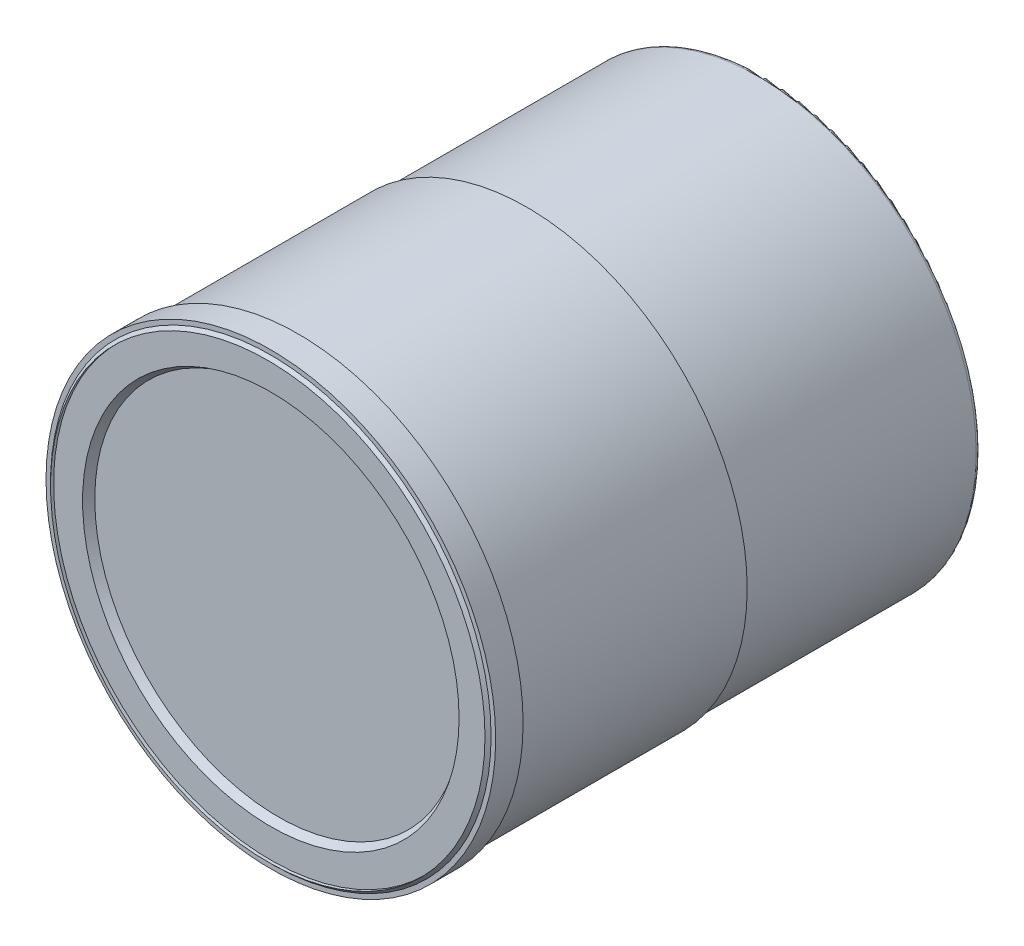
ISO-10303-21;
HEADER;
FILE_DESCRIPTION(('STEP AP214'),'2;1');
FILE_NAME('part.step','',(''),(''),'','','');
FILE_SCHEMA(('AUTOMOTIVE_DESIGN { 1 0 10303 214 1 1 1 1 }'));
ENDSEC;
DATA;
#1=APPLICATION_CONTEXT('core data for automotive mechanical design processes');
#2=APPLICATION_PROTOCOL_DEFINITION('international standard','automotive_design',2000,#1);
#3=PRODUCT_CONTEXT('',#1,'mechanical');
#4=PRODUCT('Part','Part','',(#3));
#5=PRODUCT_RELATED_PRODUCT_CATEGORY('part','',(#4));
#6=PRODUCT_DEFINITION_FORMATION('','',#4);
#7=PRODUCT_DEFINITION_CONTEXT('part definition',#1,'design');
#8=PRODUCT_DEFINITION('design','',#6,#7);
#9=PRODUCT_DEFINITION_SHAPE('','',#8);
#10=(LENGTH_UNIT() NAMED_UNIT(*) SI_UNIT(.MILLI.,.METRE.));
#11=(NAMED_UNIT(*) PLANE_ANGLE_UNIT() SI_UNIT($,.RADIAN.));
#12=(NAMED_UNIT(*) SI_UNIT($,.STERADIAN.) SOLID_ANGLE_UNIT());
#13=UNCERTAINTY_MEASURE_WITH_UNIT(LENGTH_MEASURE(1.E-05),#10,'distance_accuracy_value','');
#14=(GEOMETRIC_REPRESENTATION_CONTEXT(3) GLOBAL_UNCERTAINTY_ASSIGNED_CONTEXT((#13)) GLOBAL_UNIT_ASSIGNED_CONTEXT((#10,
#11,#12)) REPRESENTATION_CONTEXT('',''));
#15=CARTESIAN_POINT('',(0.,0.,0.));
#16=DIRECTION('',(0.,0.,1.));
#17=DIRECTION('',(1.,0.,0.));
#18=AXIS2_PLACEMENT_3D('',#15,#16,#17);
#19=CARTESIAN_POINT('',(0.,0.,160.1));
#20=DIRECTION('',(0.,0.,-1.));
#21=DIRECTION('',(-1.,0.,0.));
#22=AXIS2_PLACEMENT_3D('',#19,#20,#21);
#23=CYLINDRICAL_SURFACE('',#22,72.25);
#24=CARTESIAN_POINT('',(0.,0.,77.6));
#25=DIRECTION('',(0.,0.,1.));
#26=DIRECTION('',(1.,0.,0.));
#27=AXIS2_PLACEMENT_3D('',#24,#25,#26);
#28=CIRCLE('',#27,72.25);
#29=CARTESIAN_POINT('',(72.25,0.,77.6));
#30=VERTEX_POINT('',#29);
#31=EDGE_CURVE('E90',#30,#30,#28,.T.);
#32=ORIENTED_EDGE('',*,*,#31,.T.);
#33=EDGE_LOOP('',(#32));
#34=FACE_BOUND('',#33,.T.);
#35=CARTESIAN_POINT('',(0.,0.,152.600000014));
#36=DIRECTION('',(0.,0.,1.));
#37=DIRECTION('',(1.,0.,0.));
#38=AXIS2_PLACEMENT_3D('',#35,#36,#37);
#39=CIRCLE('',#38,72.25);
#40=CARTESIAN_POINT('',(72.25,0.,152.600000014));
#41=VERTEX_POINT('',#40);
#42=EDGE_CURVE('E63',#41,#41,#39,.T.);
#43=ORIENTED_EDGE('',*,*,#42,.F.);
#44=EDGE_LOOP('',(#43));
#45=FACE_BOUND('',#44,.T.);
#46=ADVANCED_FACE('F51',(#34,#45),#23,.T.);
#47=CARTESIAN_POINT('',(0.,0.,77.6));
#48=DIRECTION('',(0.,0.,-1.));
#49=DIRECTION('',(-1.,0.,0.));
#50=AXIS2_PLACEMENT_3D('',#47,#48,#49);
#51=CYLINDRICAL_SURFACE('',#50,71.25);
#52=CARTESIAN_POINT('',(0.,0.,1.5));
#53=DIRECTION('',(0.,0.,1.));
#54=DIRECTION('',(1.,0.,0.));
#55=AXIS2_PLACEMENT_3D('',#52,#53,#54);
#56=CIRCLE('',#55,71.25);
#57=CARTESIAN_POINT('',(71.25,0.,1.5));
#58=VERTEX_POINT('',#57);
#59=EDGE_CURVE('E84',#58,#58,#56,.T.);
#60=ORIENTED_EDGE('',*,*,#59,.T.);
#61=EDGE_LOOP('',(#60));
#62=FACE_BOUND('',#61,.T.);
#63=CARTESIAN_POINT('',(0.,0.,77.6));
#64=DIRECTION('',(0.,0.,1.));
#65=DIRECTION('',(1.,0.,0.));
#66=AXIS2_PLACEMENT_3D('',#63,#64,#65);
#67=CIRCLE('',#66,71.25);
#68=CARTESIAN_POINT('',(71.25,0.,77.6));
#69=VERTEX_POINT('',#68);
#70=EDGE_CURVE('E87',#69,#69,#67,.T.);
#71=ORIENTED_EDGE('',*,*,#70,.F.);
#72=EDGE_LOOP('',(#71));
#73=FACE_BOUND('',#72,.T.);
#74=ADVANCED_FACE('F120',(#62,#73),#51,.T.);
#75=CARTESIAN_POINT('',(0.,0.,0.));
#76=DIRECTION('',(0.,0.,1.));
#77=DIRECTION('',(1.,0.,0.));
#78=AXIS2_PLACEMENT_3D('',#75,#76,#77);
#79=PLANE('',#78);
#80=CARTESIAN_POINT('',(0.,0.,0.));
#81=DIRECTION('',(0.,0.,1.));
#82=DIRECTION('',(1.,0.,0.));
#83=AXIS2_PLACEMENT_3D('',#80,#81,#82);
#84=CIRCLE('',#83,69.75);
#85=CARTESIAN_POINT('',(69.75,0.,0.));
#86=VERTEX_POINT('',#85);
#87=EDGE_CURVE('E78',#86,#86,#84,.F.);
#88=ORIENTED_EDGE('',*,*,#87,.T.);
#89=EDGE_LOOP('',(#88));
#90=FACE_BOUND('',#89,.T.);
#91=CARTESIAN_POINT('',(0.,0.,0.));
#92=DIRECTION('',(0.,0.,1.));
#93=DIRECTION('',(1.,0.,0.));
#94=AXIS2_PLACEMENT_3D('',#91,#92,#93);
#95=CIRCLE('',#94,47.75);
#96=CARTESIAN_POINT('',(47.75,0.,0.));
#97=VERTEX_POINT('',#96);
#98=EDGE_CURVE('E81',#97,#97,#95,.T.);
#99=ORIENTED_EDGE('',*,*,#98,.T.);
#100=EDGE_LOOP('',(#99));
#101=FACE_BOUND('',#100,.T.);
#102=ADVANCED_FACE('F128',(#90,#101),#79,.F.);
#103=CARTESIAN_POINT('',(0.,0.,77.6));
#104=DIRECTION('',(0.,0.,1.));
#105=DIRECTION('',(1.,0.,0.));
#106=AXIS2_PLACEMENT_3D('',#103,#104,#105);
#107=PLANE('',#106);
#108=ORIENTED_EDGE('',*,*,#70,.T.);
#109=EDGE_LOOP('',(#108));
#110=FACE_BOUND('',#109,.T.);
#111=ORIENTED_EDGE('',*,*,#31,.F.);
#112=EDGE_LOOP('',(#111));
#113=FACE_BOUND('',#112,.T.);
#114=ADVANCED_FACE('F134',(#110,#113),#107,.F.);
#115=CARTESIAN_POINT('',(0.,0.,100.7));
#116=DIRECTION('',(0.,0.,-1.));
#117=DIRECTION('',(-1.,0.,0.));
#118=AXIS2_PLACEMENT_3D('',#115,#116,#117);
#119=CYLINDRICAL_SURFACE('',#118,46.25);
#120=CARTESIAN_POINT('',(0.,0.,1.5));
#121=DIRECTION('',(0.,0.,1.));
#122=DIRECTION('',(1.,0.,0.));
#123=AXIS2_PLACEMENT_3D('',#120,#121,#122);
#124=CIRCLE('',#123,46.25);
#125=CARTESIAN_POINT('',(46.25,0.,1.5));
#126=VERTEX_POINT('',#125);
#127=EDGE_CURVE('E72',#126,#126,#124,.F.);
#128=ORIENTED_EDGE('',*,*,#127,.T.);
#129=EDGE_LOOP('',(#128));
#130=FACE_BOUND('',#129,.T.);
#131=CARTESIAN_POINT('',(0.,0.,99.2));
#132=DIRECTION('',(0.,0.,1.));
#133=DIRECTION('',(1.,0.,0.));
#134=AXIS2_PLACEMENT_3D('',#131,#132,#133);
#135=CIRCLE('',#134,46.25);
#136=CARTESIAN_POINT('',(46.25,0.,99.2));
#137=VERTEX_POINT('',#136);
#138=EDGE_CURVE('E75',#137,#137,#135,.T.);
#139=ORIENTED_EDGE('',*,*,#138,.T.);
#140=EDGE_LOOP('',(#139));
#141=FACE_BOUND('',#140,.T.);
#142=ADVANCED_FACE('F180',(#130,#141),#119,.F.);
#143=CARTESIAN_POINT('',(0.,0.,100.7));
#144=DIRECTION('',(0.,0.,1.));
#145=DIRECTION('',(1.,0.,0.));
#146=AXIS2_PLACEMENT_3D('',#143,#144,#145);
#147=PLANE('',#146);
#148=CARTESIAN_POINT('',(0.,0.,100.7));
#149=DIRECTION('',(0.,0.,1.));
#150=DIRECTION('',(1.,0.,0.));
#151=AXIS2_PLACEMENT_3D('',#148,#149,#150);
#152=CIRCLE('',#151,44.75);
#153=CARTESIAN_POINT('',(44.75,0.,100.7));
#154=VERTEX_POINT('',#153);
#155=EDGE_CURVE('E67',#154,#154,#152,.F.);
#156=ORIENTED_EDGE('',*,*,#155,.T.);
#157=EDGE_LOOP('',(#156));
#158=FACE_BOUND('',#157,.T.);
#159=ADVANCED_FACE('F143',(#158),#147,.F.);
#160=CARTESIAN_POINT('',(0.,0.,1.5));
#161=DIRECTION('',(0.,0.,1.));
#162=DIRECTION('',(1.,0.,0.));
#163=AXIS2_PLACEMENT_3D('',#160,#161,#162);
#164=TOROIDAL_SURFACE('',#163,69.75,1.5);
#165=ORIENTED_EDGE('',*,*,#87,.F.);
#166=EDGE_LOOP('',(#165));
#167=FACE_BOUND('',#166,.T.);
#168=ORIENTED_EDGE('',*,*,#59,.F.);
#169=EDGE_LOOP('',(#168));
#170=FACE_BOUND('',#169,.T.);
#171=ADVANCED_FACE('F139',(#167,#170),#164,.T.);
#172=CARTESIAN_POINT('',(0.,0.,1.5));
#173=DIRECTION('',(0.,0.,1.));
#174=DIRECTION('',(1.,0.,0.));
#175=AXIS2_PLACEMENT_3D('',#172,#173,#174);
#176=TOROIDAL_SURFACE('',#175,47.75,1.5);
#177=ORIENTED_EDGE('',*,*,#127,.F.);
#178=EDGE_LOOP('',(#177));
#179=FACE_BOUND('',#178,.T.);
#180=ORIENTED_EDGE('',*,*,#98,.F.);
#181=EDGE_LOOP('',(#180));
#182=FACE_BOUND('',#181,.T.);
#183=ADVANCED_FACE('F142',(#179,#182),#176,.T.);
#184=CARTESIAN_POINT('',(0.,0.,99.2));
#185=DIRECTION('',(0.,0.,1.));
#186=DIRECTION('',(1.,0.,0.));
#187=AXIS2_PLACEMENT_3D('',#184,#185,#186);
#188=TOROIDAL_SURFACE('',#187,44.75,1.5);
#189=ORIENTED_EDGE('',*,*,#155,.F.);
#190=EDGE_LOOP('',(#189));
#191=FACE_BOUND('',#190,.T.);
#192=ORIENTED_EDGE('',*,*,#138,.F.);
#193=EDGE_LOOP('',(#192));
#194=FACE_BOUND('',#193,.T.);
#195=ADVANCED_FACE('F147',(#191,#194),#188,.F.);
#196=CARTESIAN_POINT('',(0.,0.,161.6));
#197=DIRECTION('',(0.,0.,-1.));
#198=DIRECTION('',(-1.,0.,0.));
#199=AXIS2_PLACEMENT_3D('',#196,#197,#198);
#200=CYLINDRICAL_SURFACE('',#199,73.75);
#201=CARTESIAN_POINT('',(0.,0.,161.6));
#202=DIRECTION('',(0.,0.,1.));
#203=DIRECTION('',(1.,0.,0.));
#204=AXIS2_PLACEMENT_3D('',#201,#202,#203);
#205=CIRCLE('',#204,73.75);
#206=CARTESIAN_POINT('',(73.75,0.,161.6));
#207=VERTEX_POINT('',#206);
#208=EDGE_CURVE('E93',#207,#207,#205,.T.);
#209=ORIENTED_EDGE('',*,*,#208,.F.);
#210=EDGE_LOOP('',(#209));
#211=FACE_BOUND('',#210,.T.);
#212=CARTESIAN_POINT('',(0.,0.,152.600000014));
#213=DIRECTION('',(0.,0.,1.));
#214=DIRECTION('',(1.,0.,0.));
#215=AXIS2_PLACEMENT_3D('',#212,#213,#214);
#216=CIRCLE('',#215,73.75);
#217=CARTESIAN_POINT('',(73.75,0.,152.600000014));
#218=VERTEX_POINT('',#217);
#219=EDGE_CURVE('E96',#218,#218,#216,.T.);
#220=ORIENTED_EDGE('',*,*,#219,.T.);
#221=EDGE_LOOP('',(#220));
#222=FACE_BOUND('',#221,.T.);
#223=ADVANCED_FACE('F149',(#211,#222),#200,.T.);
#224=CARTESIAN_POINT('',(0.,0.,161.6));
#225=DIRECTION('',(0.,0.,1.));
#226=DIRECTION('',(1.,0.,0.));
#227=AXIS2_PLACEMENT_3D('',#224,#225,#226);
#228=PLANE('',#227);
#229=CARTESIAN_POINT('',(0.,0.,161.6));
#230=DIRECTION('',(0.,0.,1.));
#231=DIRECTION('',(1.,0.,0.));
#232=AXIS2_PLACEMENT_3D('',#229,#230,#231);
#233=CIRCLE('',#232,72.25);
#234=CARTESIAN_POINT('',(72.25,0.,161.6));
#235=VERTEX_POINT('',#234);
#236=EDGE_CURVE('E99',#235,#235,#233,.T.);
#237=ORIENTED_EDGE('',*,*,#236,.F.);
#238=EDGE_LOOP('',(#237));
#239=FACE_BOUND('',#238,.T.);
#240=ORIENTED_EDGE('',*,*,#208,.T.);
#241=EDGE_LOOP('',(#240));
#242=FACE_BOUND('',#241,.T.);
#243=ADVANCED_FACE('F162',(#239,#242),#228,.T.);
#244=CARTESIAN_POINT('',(0.,0.,152.600000014));
#245=DIRECTION('',(0.,0.,1.));
#246=DIRECTION('',(1.,0.,0.));
#247=AXIS2_PLACEMENT_3D('',#244,#245,#246);
#248=PLANE('',#247);
#249=ORIENTED_EDGE('',*,*,#42,.T.);
#250=EDGE_LOOP('',(#249));
#251=FACE_BOUND('',#250,.T.);
#252=ORIENTED_EDGE('',*,*,#219,.F.);
#253=EDGE_LOOP('',(#252));
#254=FACE_BOUND('',#253,.T.);
#255=ADVANCED_FACE('F167',(#251,#254),#248,.F.);
#256=CARTESIAN_POINT('',(0.,0.,162.6));
#257=DIRECTION('',(0.,0.,-1.));
#258=DIRECTION('',(-1.,0.,0.));
#259=AXIS2_PLACEMENT_3D('',#256,#257,#258);
#260=CYLINDRICAL_SURFACE('',#259,71.25);
#261=CARTESIAN_POINT('',(0.,0.,162.6));
#262=DIRECTION('',(0.,0.,1.));
#263=DIRECTION('',(1.,0.,0.));
#264=AXIS2_PLACEMENT_3D('',#261,#262,#263);
#265=CIRCLE('',#264,71.25);
#266=CARTESIAN_POINT('',(71.25,0.,162.6));
#267=VERTEX_POINT('',#266);
#268=EDGE_CURVE('E102',#267,#267,#265,.T.);
#269=ORIENTED_EDGE('',*,*,#268,.T.);
#270=EDGE_LOOP('',(#269));
#271=FACE_BOUND('',#270,.T.);
#272=CARTESIAN_POINT('',(0.,0.,161.6));
#273=DIRECTION('',(0.,0.,1.));
#274=DIRECTION('',(1.,0.,0.));
#275=AXIS2_PLACEMENT_3D('',#272,#273,#274);
#276=CIRCLE('',#275,71.25);
#277=CARTESIAN_POINT('',(71.25,0.,161.6));
#278=VERTEX_POINT('',#277);
#279=EDGE_CURVE('E59',#278,#278,#276,.F.);
#280=ORIENTED_EDGE('',*,*,#279,.T.);
#281=EDGE_LOOP('',(#280));
#282=FACE_BOUND('',#281,.T.);
#283=ADVANCED_FACE('F160',(#271,#282),#260,.F.);
#284=CARTESIAN_POINT('',(0.,0.,161.6));
#285=DIRECTION('',(0.,0.,1.));
#286=DIRECTION('',(1.,0.,0.));
#287=AXIS2_PLACEMENT_3D('',#284,#285,#286);
#288=CIRCLE('',#287,61.75);
#289=CARTESIAN_POINT('',(61.75,0.,161.6));
#290=VERTEX_POINT('',#289);
#291=EDGE_CURVE('E11',#290,#290,#288,.F.);
#292=ORIENTED_EDGE('',*,*,#291,.T.);
#293=EDGE_LOOP('',(#292));
#294=FACE_BOUND('',#293,.T.);
#295=ORIENTED_EDGE('',*,*,#279,.F.);
#296=EDGE_LOOP('',(#295));
#297=FACE_BOUND('',#296,.T.);
#298=ADVANCED_FACE('F155',(#294,#297),#228,.T.);
#299=CARTESIAN_POINT('',(0.,0.,162.6));
#300=DIRECTION('',(0.,0.,-1.));
#301=DIRECTION('',(-1.,0.,0.));
#302=AXIS2_PLACEMENT_3D('',#299,#300,#301);
#303=CONICAL_SURFACE('',#302,71.25,0.785398163397462);
#304=ORIENTED_EDGE('',*,*,#236,.T.);
#305=EDGE_LOOP('',(#304));
#306=FACE_BOUND('',#305,.T.);
#307=ORIENTED_EDGE('',*,*,#268,.F.);
#308=EDGE_LOOP('',(#307));
#309=FACE_BOUND('',#308,.T.);
#310=ADVANCED_FACE('F117',(#306,#309),#303,.T.);
#311=CARTESIAN_POINT('',(0.,0.,159.1));
#312=DIRECTION('',(0.,0.,1.));
#313=DIRECTION('',(1.,0.,0.));
#314=AXIS2_PLACEMENT_3D('',#311,#312,#313);
#315=PLANE('',#314);
#316=CARTESIAN_POINT('',(0.,0.,159.1));
#317=DIRECTION('',(0.,0.,1.));
#318=DIRECTION('',(1.,0.,0.));
#319=AXIS2_PLACEMENT_3D('',#316,#317,#318);
#320=CIRCLE('',#319,60.25);
#321=CARTESIAN_POINT('',(60.25,0.,159.1));
#322=VERTEX_POINT('',#321);
#323=EDGE_CURVE('E105',#322,#322,#320,.T.);
#324=ORIENTED_EDGE('',*,*,#323,.T.);
#325=EDGE_LOOP('',(#324));
#326=FACE_BOUND('',#325,.T.);
#327=ADVANCED_FACE('F109',(#326),#315,.T.);
#328=CARTESIAN_POINT('',(0.,0.,159.1));
#329=DIRECTION('',(0.,0.,1.));
#330=DIRECTION('',(1.,0.,0.));
#331=AXIS2_PLACEMENT_3D('',#328,#329,#330);
#332=CONICAL_SURFACE('',#331,60.25,0.540419500270582);
#333=ORIENTED_EDGE('',*,*,#291,.F.);
#334=EDGE_LOOP('',(#333));
#335=FACE_BOUND('',#334,.T.);
#336=ORIENTED_EDGE('',*,*,#323,.F.);
#337=EDGE_LOOP('',(#336));
#338=FACE_BOUND('',#337,.T.);
#339=ADVANCED_FACE('F54',(#335,#338),#332,.F.);
#340=CLOSED_SHELL('',(#46,#74,#102,#114,#142,#159,#171,#183,#195,#223,#243,#255,#283,#298,#310,
#327,#339));
#341=MANIFOLD_SOLID_BREP('B2',#340);
#342=ADVANCED_BREP_SHAPE_REPRESENTATION('',(#18,#341),#14);
#343=SHAPE_DEFINITION_REPRESENTATION(#9,#342);
ENDSEC;
END-ISO-10303-21;
